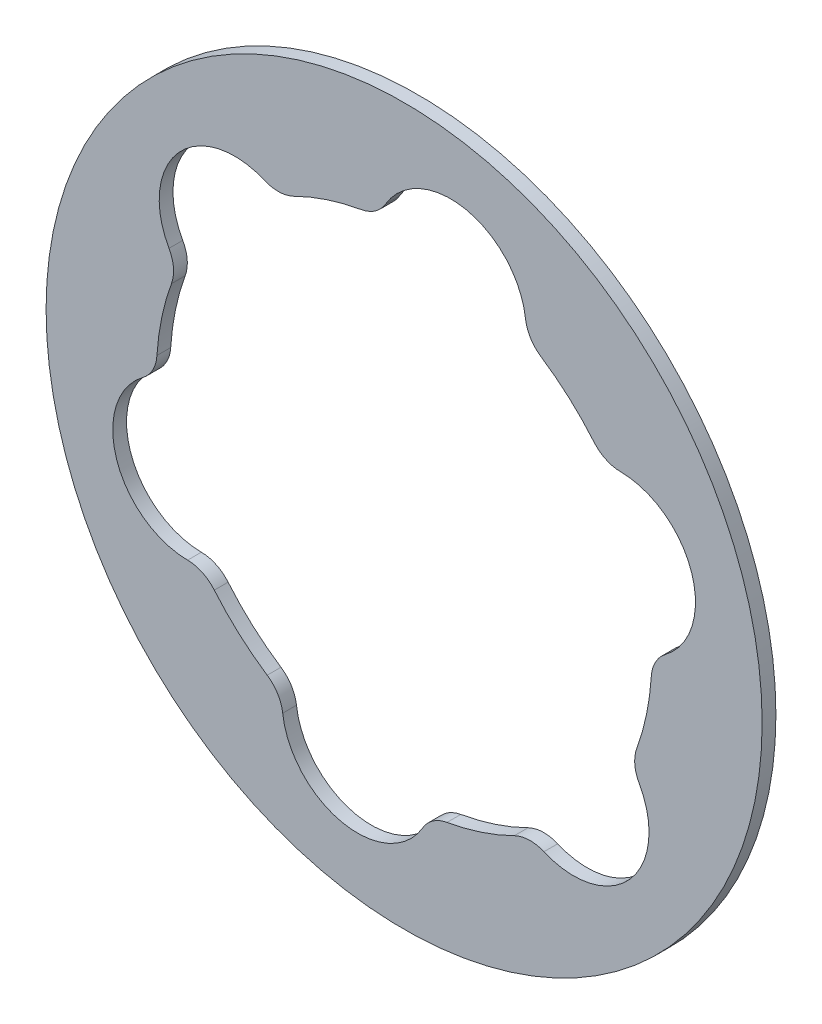
ISO-10303-21;
HEADER;
FILE_DESCRIPTION(('STEP AP214'),'2;1');
FILE_NAME('part.step','',(''),(''),'','','');
FILE_SCHEMA(('AUTOMOTIVE_DESIGN { 1 0 10303 214 1 1 1 1 }'));
ENDSEC;
DATA;
#1=APPLICATION_CONTEXT('core data for automotive mechanical design processes');
#2=APPLICATION_PROTOCOL_DEFINITION('international standard','automotive_design',2000,#1);
#3=PRODUCT_CONTEXT('',#1,'mechanical');
#4=PRODUCT('Part','Part','',(#3));
#5=PRODUCT_RELATED_PRODUCT_CATEGORY('part','',(#4));
#6=PRODUCT_DEFINITION_FORMATION('','',#4);
#7=PRODUCT_DEFINITION_CONTEXT('part definition',#1,'design');
#8=PRODUCT_DEFINITION('design','',#6,#7);
#9=PRODUCT_DEFINITION_SHAPE('','',#8);
#10=(LENGTH_UNIT() NAMED_UNIT(*) SI_UNIT(.MILLI.,.METRE.));
#11=(NAMED_UNIT(*) PLANE_ANGLE_UNIT() SI_UNIT($,.RADIAN.));
#12=(NAMED_UNIT(*) SI_UNIT($,.STERADIAN.) SOLID_ANGLE_UNIT());
#13=UNCERTAINTY_MEASURE_WITH_UNIT(LENGTH_MEASURE(1.E-05),#10,'distance_accuracy_value','');
#14=(GEOMETRIC_REPRESENTATION_CONTEXT(3) GLOBAL_UNCERTAINTY_ASSIGNED_CONTEXT((#13)) GLOBAL_UNIT_ASSIGNED_CONTEXT((#10,
#11,#12)) REPRESENTATION_CONTEXT('',''));
#15=CARTESIAN_POINT('',(0.,0.,0.));
#16=DIRECTION('',(0.,0.,1.));
#17=DIRECTION('',(1.,0.,0.));
#18=AXIS2_PLACEMENT_3D('',#15,#16,#17);
#19=CARTESIAN_POINT('',(0.,0.,0.79375));
#20=DIRECTION('',(0.,0.,1.));
#21=DIRECTION('',(1.,0.,0.));
#22=AXIS2_PLACEMENT_3D('',#19,#20,#21);
#23=PLANE('',#22);
#24=CARTESIAN_POINT('',(596.855492872776,216.819657331889,0.79375));
#25=DIRECTION('',(0.,0.,1.));
#26=DIRECTION('',(1.,0.,0.));
#27=AXIS2_PLACEMENT_3D('',#24,#25,#26);
#28=CIRCLE('',#27,20.6375);
#29=CARTESIAN_POINT('',(617.492992872776,216.819657331889,0.79375));
#30=VERTEX_POINT('',#29);
#31=EDGE_CURVE('E246',#30,#30,#28,.T.);
#32=ORIENTED_EDGE('',*,*,#31,.T.);
#33=EDGE_LOOP('',(#32));
#34=FACE_BOUND('',#33,.T.);
#35=CARTESIAN_POINT('',(609.296784940073,220.911403470376,0.79375));
#36=DIRECTION('',(0.,0.,1.));
#37=DIRECTION('',(1.,0.,0.));
#38=AXIS2_PLACEMENT_3D('',#35,#36,#37);
#39=CIRCLE('',#38,4.35292500000051);
#40=CARTESIAN_POINT('',(611.910584746842,217.43059801391,0.79375));
#41=VERTEX_POINT('',#40);
#42=CARTESIAN_POINT('',(609.334246487327,225.264167269172,0.79375));
#43=VERTEX_POINT('',#42);
#44=EDGE_CURVE('E347',#41,#43,#39,.T.);
#45=ORIENTED_EDGE('',*,*,#44,.F.);
#46=CARTESIAN_POINT('',(613.130739288295,215.805714358083,0.79375));
#47=DIRECTION('',(0.,0.,1.));
#48=DIRECTION('',(1.,0.,0.));
#49=AXIS2_PLACEMENT_3D('',#46,#47,#48);
#50=CIRCLE('',#49,2.032);
#51=CARTESIAN_POINT('',(611.102671199134,215.932062392202,0.79375));
#52=VERTEX_POINT('',#51);
#53=EDGE_CURVE('E295',#41,#52,#50,.T.);
#54=ORIENTED_EDGE('',*,*,#53,.T.);
#55=CARTESIAN_POINT('',(596.855492872776,216.819657331889,0.79375));
#56=DIRECTION('',(0.,0.,1.));
#57=DIRECTION('',(1.,0.,0.));
#58=AXIS2_PLACEMENT_3D('',#55,#56,#57);
#59=CIRCLE('',#58,14.2748000000001);
#60=CARTESIAN_POINT('',(610.267315739796,211.931618622583,0.79375));
#61=VERTEX_POINT('',#60);
#62=EDGE_CURVE('E360',#61,#52,#59,.T.);
#63=ORIENTED_EDGE('',*,*,#62,.F.);
#64=CARTESIAN_POINT('',(612.176472019799,211.235812400618,0.79375));
#65=DIRECTION('',(0.,0.,1.));
#66=DIRECTION('',(1.,0.,0.));
#67=AXIS2_PLACEMENT_3D('',#64,#65,#66);
#68=CIRCLE('',#67,2.032);
#69=CARTESIAN_POINT('',(610.408029808248,210.234994662762,0.79375));
#70=VERTEX_POINT('',#69);
#71=EDGE_CURVE('E241',#61,#70,#68,.T.);
#72=ORIENTED_EDGE('',*,*,#71,.T.);
#73=CARTESIAN_POINT('',(606.619695008191,208.091055414951,0.79375));
#74=DIRECTION('',(0.,0.,1.));
#75=DIRECTION('',(1.,0.,0.));
#76=AXIS2_PLACEMENT_3D('',#73,#74,#75);
#77=CIRCLE('',#76,4.35292500000049);
#78=CARTESIAN_POINT('',(604.912128960644,204.087035653649,0.79375));
#79=VERTEX_POINT('',#78);
#80=EDGE_CURVE('E345',#79,#70,#77,.T.);
#81=ORIENTED_EDGE('',*,*,#80,.F.);
#82=CARTESIAN_POINT('',(604.115015707231,202.217908996295,0.79375));
#83=DIRECTION('',(0.,0.,1.));
#84=DIRECTION('',(1.,0.,0.));
#85=AXIS2_PLACEMENT_3D('',#82,#83,#84);
#86=CIRCLE('',#85,2.032);
#87=CARTESIAN_POINT('',(603.210402269915,204.037441499173,0.79375));
#88=VERTEX_POINT('',#87);
#89=EDGE_CURVE('E278',#79,#88,#86,.T.);
#90=ORIENTED_EDGE('',*,*,#89,.T.);
#91=CARTESIAN_POINT('',(599.328238609345,202.76065866334,0.79375));
#92=VERTEX_POINT('',#91);
#93=EDGE_CURVE('E366',#92,#88,#59,.T.);
#94=ORIENTED_EDGE('',*,*,#93,.F.);
#95=CARTESIAN_POINT('',(599.680230885013,200.75937771408,0.79375));
#96=DIRECTION('',(0.,0.,1.));
#97=DIRECTION('',(1.,0.,0.));
#98=AXIS2_PLACEMENT_3D('',#95,#96,#97);
#99=CIRCLE('',#98,2.032);
#100=CARTESIAN_POINT('',(597.929276193698,201.79048472548,0.79375));
#101=VERTEX_POINT('',#100);
#102=EDGE_CURVE('E280',#92,#101,#99,.T.);
#103=ORIENTED_EDGE('',*,*,#102,.T.);
#104=CARTESIAN_POINT('',(594.178402940894,203.999309276464,0.79375));
#105=DIRECTION('',(0.,0.,1.));
#106=DIRECTION('',(1.,0.,0.));
#107=AXIS2_PLACEMENT_3D('',#104,#105,#106);
#108=CIRCLE('',#107,4.35292499999991);
#109=CARTESIAN_POINT('',(589.857037086579,203.476094971628,0.79375));
#110=VERTEX_POINT('',#109);
#111=EDGE_CURVE('E362',#110,#101,#108,.T.);
#112=ORIENTED_EDGE('',*,*,#111,.F.);
#113=CARTESIAN_POINT('',(587.839769291713,203.2318519701,0.79375));
#114=DIRECTION('',(0.,0.,1.));
#115=DIRECTION('',(1.,0.,0.));
#116=AXIS2_PLACEMENT_3D('',#113,#114,#115);
#117=CIRCLE('',#116,2.032);
#118=CARTESIAN_POINT('',(588.963223943559,204.925036438859,0.79375));
#119=VERTEX_POINT('',#118);
#120=EDGE_CURVE('E282',#110,#119,#117,.T.);
#121=ORIENTED_EDGE('',*,*,#120,.T.);
#122=CARTESIAN_POINT('',(585.916415742325,207.648697372646,0.79375));
#123=VERTEX_POINT('',#122);
#124=EDGE_CURVE('E365',#123,#119,#59,.T.);
#125=ORIENTED_EDGE('',*,*,#124,.F.);
#126=CARTESIAN_POINT('',(584.359251737991,206.343222645351,0.79375));
#127=DIRECTION('',(0.,0.,1.));
#128=DIRECTION('',(1.,0.,0.));
#129=AXIS2_PLACEMENT_3D('',#126,#127,#128);
#130=CIRCLE('',#129,2.032);
#131=CARTESIAN_POINT('',(584.376739258225,208.375147394607,0.79375));
#132=VERTEX_POINT('',#131);
#133=EDGE_CURVE('E284',#123,#132,#130,.T.);
#134=ORIENTED_EDGE('',*,*,#133,.T.);
#135=CARTESIAN_POINT('',(584.414200805479,212.727911193402,0.79375));
#136=DIRECTION('',(0.,0.,1.));
#137=DIRECTION('',(1.,0.,0.));
#138=AXIS2_PLACEMENT_3D('',#135,#136,#137);
#139=CIRCLE('',#138,4.35292499999991);
#140=CARTESIAN_POINT('',(581.80040099871,216.208716649867,0.79375));
#141=VERTEX_POINT('',#140);
#142=EDGE_CURVE('E367',#141,#132,#139,.T.);
#143=ORIENTED_EDGE('',*,*,#142,.F.);
#144=CARTESIAN_POINT('',(580.580246457257,217.833600305694,0.79375));
#145=DIRECTION('',(0.,0.,1.));
#146=DIRECTION('',(1.,0.,0.));
#147=AXIS2_PLACEMENT_3D('',#144,#145,#146);
#148=CIRCLE('',#147,2.032);
#149=CARTESIAN_POINT('',(582.608314546418,217.707252271575,0.79375));
#150=VERTEX_POINT('',#149);
#151=EDGE_CURVE('E286',#141,#150,#148,.T.);
#152=ORIENTED_EDGE('',*,*,#151,.T.);
#153=CARTESIAN_POINT('',(583.443670005756,221.707696041195,0.79375));
#154=VERTEX_POINT('',#153);
#155=EDGE_CURVE('E370',#154,#150,#59,.T.);
#156=ORIENTED_EDGE('',*,*,#155,.F.);
#157=CARTESIAN_POINT('',(581.534513725753,222.40350226316,0.79375));
#158=DIRECTION('',(0.,0.,1.));
#159=DIRECTION('',(1.,0.,0.));
#160=AXIS2_PLACEMENT_3D('',#157,#158,#159);
#161=CIRCLE('',#160,2.032);
#162=CARTESIAN_POINT('',(583.302955937303,223.404320001015,0.79375));
#163=VERTEX_POINT('',#162);
#164=EDGE_CURVE('E275',#154,#163,#161,.T.);
#165=ORIENTED_EDGE('',*,*,#164,.T.);
#166=CARTESIAN_POINT('',(587.09129073736,225.548259248826,0.79375));
#167=DIRECTION('',(0.,0.,1.));
#168=DIRECTION('',(1.,0.,0.));
#169=AXIS2_PLACEMENT_3D('',#166,#167,#168);
#170=CIRCLE('',#169,4.3529250000004);
#171=CARTESIAN_POINT('',(588.798856784906,229.552279010128,0.79375));
#172=VERTEX_POINT('',#171);
#173=EDGE_CURVE('E371',#172,#163,#170,.T.);
#174=ORIENTED_EDGE('',*,*,#173,.F.);
#175=CARTESIAN_POINT('',(589.59597003832,231.421405667483,0.79375));
#176=DIRECTION('',(0.,0.,1.));
#177=DIRECTION('',(1.,0.,0.));
#178=AXIS2_PLACEMENT_3D('',#175,#176,#177);
#179=CIRCLE('',#178,2.032);
#180=CARTESIAN_POINT('',(590.500583475635,229.601873164605,0.79375));
#181=VERTEX_POINT('',#180);
#182=EDGE_CURVE('E288',#172,#181,#179,.T.);
#183=ORIENTED_EDGE('',*,*,#182,.T.);
#184=CARTESIAN_POINT('',(594.382747136207,230.878656000439,0.79375));
#185=VERTEX_POINT('',#184);
#186=EDGE_CURVE('E361',#185,#181,#59,.T.);
#187=ORIENTED_EDGE('',*,*,#186,.F.);
#188=CARTESIAN_POINT('',(594.030754860538,232.879936949699,0.79375));
#189=DIRECTION('',(0.,0.,1.));
#190=DIRECTION('',(1.,0.,0.));
#191=AXIS2_PLACEMENT_3D('',#188,#189,#190);
#192=CIRCLE('',#191,2.032);
#193=CARTESIAN_POINT('',(595.781709551855,231.848829938298,0.79375));
#194=VERTEX_POINT('',#193);
#195=EDGE_CURVE('E290',#185,#194,#192,.T.);
#196=ORIENTED_EDGE('',*,*,#195,.T.);
#197=CARTESIAN_POINT('',(599.532582804658,229.640005387314,0.79375));
#198=DIRECTION('',(0.,0.,1.));
#199=DIRECTION('',(1.,0.,0.));
#200=AXIS2_PLACEMENT_3D('',#197,#198,#199);
#201=CIRCLE('',#200,4.35292500000017);
#202=CARTESIAN_POINT('',(603.853948658973,230.16321969215,0.79375));
#203=VERTEX_POINT('',#202);
#204=EDGE_CURVE('E354',#203,#194,#201,.T.);
#205=ORIENTED_EDGE('',*,*,#204,.F.);
#206=CARTESIAN_POINT('',(605.871216453839,230.407462693678,0.79375));
#207=DIRECTION('',(0.,0.,1.));
#208=DIRECTION('',(1.,0.,0.));
#209=AXIS2_PLACEMENT_3D('',#206,#207,#208);
#210=CIRCLE('',#209,2.032);
#211=CARTESIAN_POINT('',(604.747761801994,228.71427822492,0.79375));
#212=VERTEX_POINT('',#211);
#213=EDGE_CURVE('E68',#203,#212,#210,.T.);
#214=ORIENTED_EDGE('',*,*,#213,.T.);
#215=CARTESIAN_POINT('',(607.794570003227,225.990617291132,0.79375));
#216=VERTEX_POINT('',#215);
#217=EDGE_CURVE('E357',#216,#212,#59,.T.);
#218=ORIENTED_EDGE('',*,*,#217,.F.);
#219=CARTESIAN_POINT('',(609.351734007562,227.296092018427,0.79375));
#220=DIRECTION('',(0.,0.,1.));
#221=DIRECTION('',(1.,0.,0.));
#222=AXIS2_PLACEMENT_3D('',#219,#220,#221);
#223=CIRCLE('',#222,2.032);
#224=EDGE_CURVE('E293',#216,#43,#223,.T.);
#225=ORIENTED_EDGE('',*,*,#224,.T.);
#226=EDGE_LOOP('',(#45,#54,#63,#72,#81,#90,#94,#103,#112,#121,#125,#134,#143,#152,#156,#165,
#174,#183,#187,#196,#205,#214,#218,#225));
#227=FACE_BOUND('',#226,.T.);
#228=ADVANCED_FACE('F53',(#34,#227),#23,.T.);
#229=CARTESIAN_POINT('',(0.,0.,0.));
#230=DIRECTION('',(0.,0.,1.));
#231=DIRECTION('',(1.,0.,0.));
#232=AXIS2_PLACEMENT_3D('',#229,#230,#231);
#233=PLANE('',#232);
#234=CARTESIAN_POINT('',(596.855492872776,216.819657331889,0.));
#235=DIRECTION('',(0.,0.,1.));
#236=DIRECTION('',(1.,0.,0.));
#237=AXIS2_PLACEMENT_3D('',#234,#235,#236);
#238=CIRCLE('',#237,20.6375);
#239=CARTESIAN_POINT('',(617.492992872776,216.819657331889,0.));
#240=VERTEX_POINT('',#239);
#241=EDGE_CURVE('E358',#240,#240,#238,.T.);
#242=ORIENTED_EDGE('',*,*,#241,.F.);
#243=EDGE_LOOP('',(#242));
#244=FACE_BOUND('',#243,.T.);
#245=CARTESIAN_POINT('',(596.855492872776,216.819657331889,0.));
#246=DIRECTION('',(0.,0.,1.));
#247=DIRECTION('',(1.,0.,0.));
#248=AXIS2_PLACEMENT_3D('',#245,#246,#247);
#249=CIRCLE('',#248,14.2748000000001);
#250=CARTESIAN_POINT('',(610.267315739796,211.931618622583,0.));
#251=VERTEX_POINT('',#250);
#252=CARTESIAN_POINT('',(611.102671199134,215.932062392202,0.));
#253=VERTEX_POINT('',#252);
#254=EDGE_CURVE('E218',#251,#253,#249,.T.);
#255=ORIENTED_EDGE('',*,*,#254,.T.);
#256=CARTESIAN_POINT('',(613.130739288295,215.805714358083,0.));
#257=DIRECTION('',(0.,0.,1.));
#258=DIRECTION('',(1.,0.,0.));
#259=AXIS2_PLACEMENT_3D('',#256,#257,#258);
#260=CIRCLE('',#259,2.032);
#261=CARTESIAN_POINT('',(611.910584746842,217.43059801391,0.));
#262=VERTEX_POINT('',#261);
#263=EDGE_CURVE('E268',#253,#262,#260,.F.);
#264=ORIENTED_EDGE('',*,*,#263,.T.);
#265=CARTESIAN_POINT('',(609.296784940073,220.911403470376,0.));
#266=DIRECTION('',(0.,0.,1.));
#267=DIRECTION('',(1.,0.,0.));
#268=AXIS2_PLACEMENT_3D('',#265,#266,#267);
#269=CIRCLE('',#268,4.35292500000051);
#270=CARTESIAN_POINT('',(609.334246487327,225.264167269172,0.));
#271=VERTEX_POINT('',#270);
#272=EDGE_CURVE('E242',#271,#262,#269,.F.);
#273=ORIENTED_EDGE('',*,*,#272,.F.);
#274=CARTESIAN_POINT('',(609.351734007562,227.296092018427,0.));
#275=DIRECTION('',(0.,0.,1.));
#276=DIRECTION('',(1.,0.,0.));
#277=AXIS2_PLACEMENT_3D('',#274,#275,#276);
#278=CIRCLE('',#277,2.032);
#279=CARTESIAN_POINT('',(607.794570003227,225.990617291132,0.));
#280=VERTEX_POINT('',#279);
#281=EDGE_CURVE('E266',#271,#280,#278,.F.);
#282=ORIENTED_EDGE('',*,*,#281,.T.);
#283=CARTESIAN_POINT('',(604.747761801994,228.71427822492,0.));
#284=VERTEX_POINT('',#283);
#285=EDGE_CURVE('E237',#280,#284,#249,.T.);
#286=ORIENTED_EDGE('',*,*,#285,.T.);
#287=CARTESIAN_POINT('',(605.871216453839,230.407462693678,0.));
#288=DIRECTION('',(0.,0.,1.));
#289=DIRECTION('',(1.,0.,0.));
#290=AXIS2_PLACEMENT_3D('',#287,#288,#289);
#291=CIRCLE('',#290,2.032);
#292=CARTESIAN_POINT('',(603.853948658973,230.16321969215,0.));
#293=VERTEX_POINT('',#292);
#294=EDGE_CURVE('E264',#284,#293,#291,.F.);
#295=ORIENTED_EDGE('',*,*,#294,.T.);
#296=CARTESIAN_POINT('',(599.532582804658,229.640005387314,0.));
#297=DIRECTION('',(0.,0.,1.));
#298=DIRECTION('',(1.,0.,0.));
#299=AXIS2_PLACEMENT_3D('',#296,#297,#298);
#300=CIRCLE('',#299,4.35292500000017);
#301=CARTESIAN_POINT('',(595.781709551855,231.848829938298,0.));
#302=VERTEX_POINT('',#301);
#303=EDGE_CURVE('E350',#293,#302,#300,.T.);
#304=ORIENTED_EDGE('',*,*,#303,.T.);
#305=CARTESIAN_POINT('',(594.030754860538,232.879936949699,0.));
#306=DIRECTION('',(0.,0.,1.));
#307=DIRECTION('',(1.,0.,0.));
#308=AXIS2_PLACEMENT_3D('',#305,#306,#307);
#309=CIRCLE('',#308,2.032);
#310=CARTESIAN_POINT('',(594.382747136207,230.878656000439,0.));
#311=VERTEX_POINT('',#310);
#312=EDGE_CURVE('E262',#302,#311,#309,.F.);
#313=ORIENTED_EDGE('',*,*,#312,.T.);
#314=CARTESIAN_POINT('',(590.500583475635,229.601873164605,0.));
#315=VERTEX_POINT('',#314);
#316=EDGE_CURVE('E389',#311,#315,#249,.T.);
#317=ORIENTED_EDGE('',*,*,#316,.T.);
#318=CARTESIAN_POINT('',(589.59597003832,231.421405667483,0.));
#319=DIRECTION('',(0.,0.,1.));
#320=DIRECTION('',(1.,0.,0.));
#321=AXIS2_PLACEMENT_3D('',#318,#319,#320);
#322=CIRCLE('',#321,2.032);
#323=CARTESIAN_POINT('',(588.798856784906,229.552279010128,0.));
#324=VERTEX_POINT('',#323);
#325=EDGE_CURVE('E260',#315,#324,#322,.F.);
#326=ORIENTED_EDGE('',*,*,#325,.T.);
#327=CARTESIAN_POINT('',(587.09129073736,225.548259248826,0.));
#328=DIRECTION('',(0.,0.,1.));
#329=DIRECTION('',(1.,0.,0.));
#330=AXIS2_PLACEMENT_3D('',#327,#328,#329);
#331=CIRCLE('',#330,4.3529250000004);
#332=CARTESIAN_POINT('',(583.302955937303,223.404320001015,0.));
#333=VERTEX_POINT('',#332);
#334=EDGE_CURVE('E387',#324,#333,#331,.T.);
#335=ORIENTED_EDGE('',*,*,#334,.T.);
#336=CARTESIAN_POINT('',(581.534513725753,222.40350226316,0.));
#337=DIRECTION('',(0.,0.,1.));
#338=DIRECTION('',(1.,0.,0.));
#339=AXIS2_PLACEMENT_3D('',#336,#337,#338);
#340=CIRCLE('',#339,2.032);
#341=CARTESIAN_POINT('',(583.443670005756,221.707696041195,0.));
#342=VERTEX_POINT('',#341);
#343=EDGE_CURVE('E226',#333,#342,#340,.F.);
#344=ORIENTED_EDGE('',*,*,#343,.T.);
#345=CARTESIAN_POINT('',(582.608314546418,217.707252271575,0.));
#346=VERTEX_POINT('',#345);
#347=EDGE_CURVE('E386',#342,#346,#249,.T.);
#348=ORIENTED_EDGE('',*,*,#347,.T.);
#349=CARTESIAN_POINT('',(580.580246457257,217.833600305694,0.));
#350=DIRECTION('',(0.,0.,1.));
#351=DIRECTION('',(1.,0.,0.));
#352=AXIS2_PLACEMENT_3D('',#349,#350,#351);
#353=CIRCLE('',#352,2.032);
#354=CARTESIAN_POINT('',(581.80040099871,216.208716649867,0.));
#355=VERTEX_POINT('',#354);
#356=EDGE_CURVE('E258',#346,#355,#353,.F.);
#357=ORIENTED_EDGE('',*,*,#356,.T.);
#358=CARTESIAN_POINT('',(584.414200805479,212.727911193402,0.));
#359=DIRECTION('',(0.,0.,1.));
#360=DIRECTION('',(1.,0.,0.));
#361=AXIS2_PLACEMENT_3D('',#358,#359,#360);
#362=CIRCLE('',#361,4.35292499999991);
#363=CARTESIAN_POINT('',(584.376739258225,208.375147394607,0.));
#364=VERTEX_POINT('',#363);
#365=EDGE_CURVE('E383',#355,#364,#362,.T.);
#366=ORIENTED_EDGE('',*,*,#365,.T.);
#367=CARTESIAN_POINT('',(584.359251737991,206.343222645351,0.));
#368=DIRECTION('',(0.,0.,1.));
#369=DIRECTION('',(1.,0.,0.));
#370=AXIS2_PLACEMENT_3D('',#367,#368,#369);
#371=CIRCLE('',#370,2.032);
#372=CARTESIAN_POINT('',(585.916415742325,207.648697372646,0.));
#373=VERTEX_POINT('',#372);
#374=EDGE_CURVE('E256',#364,#373,#371,.F.);
#375=ORIENTED_EDGE('',*,*,#374,.T.);
#376=CARTESIAN_POINT('',(588.963223943559,204.925036438859,0.));
#377=VERTEX_POINT('',#376);
#378=EDGE_CURVE('E380',#373,#377,#249,.T.);
#379=ORIENTED_EDGE('',*,*,#378,.T.);
#380=CARTESIAN_POINT('',(587.839769291713,203.2318519701,0.));
#381=DIRECTION('',(0.,0.,1.));
#382=DIRECTION('',(1.,0.,0.));
#383=AXIS2_PLACEMENT_3D('',#380,#381,#382);
#384=CIRCLE('',#383,2.032);
#385=CARTESIAN_POINT('',(589.857037086579,203.476094971628,0.));
#386=VERTEX_POINT('',#385);
#387=EDGE_CURVE('E254',#377,#386,#384,.F.);
#388=ORIENTED_EDGE('',*,*,#387,.T.);
#389=CARTESIAN_POINT('',(594.178402940894,203.999309276464,0.));
#390=DIRECTION('',(0.,0.,1.));
#391=DIRECTION('',(1.,0.,0.));
#392=AXIS2_PLACEMENT_3D('',#389,#390,#391);
#393=CIRCLE('',#392,4.35292499999991);
#394=CARTESIAN_POINT('',(597.929276193698,201.79048472548,0.));
#395=VERTEX_POINT('',#394);
#396=EDGE_CURVE('E379',#386,#395,#393,.T.);
#397=ORIENTED_EDGE('',*,*,#396,.T.);
#398=CARTESIAN_POINT('',(599.680230885013,200.75937771408,0.));
#399=DIRECTION('',(0.,0.,1.));
#400=DIRECTION('',(1.,0.,0.));
#401=AXIS2_PLACEMENT_3D('',#398,#399,#400);
#402=CIRCLE('',#401,2.032);
#403=CARTESIAN_POINT('',(599.328238609345,202.76065866334,0.));
#404=VERTEX_POINT('',#403);
#405=EDGE_CURVE('E252',#395,#404,#402,.F.);
#406=ORIENTED_EDGE('',*,*,#405,.T.);
#407=CARTESIAN_POINT('',(603.210402269915,204.037441499173,0.));
#408=VERTEX_POINT('',#407);
#409=EDGE_CURVE('E236',#404,#408,#249,.T.);
#410=ORIENTED_EDGE('',*,*,#409,.T.);
#411=CARTESIAN_POINT('',(604.115015707231,202.217908996295,0.));
#412=DIRECTION('',(0.,0.,1.));
#413=DIRECTION('',(1.,0.,0.));
#414=AXIS2_PLACEMENT_3D('',#411,#412,#413);
#415=CIRCLE('',#414,2.032);
#416=CARTESIAN_POINT('',(604.912128960644,204.087035653649,0.));
#417=VERTEX_POINT('',#416);
#418=EDGE_CURVE('E225',#408,#417,#415,.F.);
#419=ORIENTED_EDGE('',*,*,#418,.T.);
#420=CARTESIAN_POINT('',(606.619695008191,208.091055414951,0.));
#421=DIRECTION('',(0.,0.,1.));
#422=DIRECTION('',(1.,0.,0.));
#423=AXIS2_PLACEMENT_3D('',#420,#421,#422);
#424=CIRCLE('',#423,4.35292500000049);
#425=CARTESIAN_POINT('',(610.408029808248,210.234994662762,0.));
#426=VERTEX_POINT('',#425);
#427=EDGE_CURVE('E220',#417,#426,#424,.T.);
#428=ORIENTED_EDGE('',*,*,#427,.T.);
#429=CARTESIAN_POINT('',(612.176472019799,211.235812400618,0.));
#430=DIRECTION('',(0.,0.,1.));
#431=DIRECTION('',(1.,0.,0.));
#432=AXIS2_PLACEMENT_3D('',#429,#430,#431);
#433=CIRCLE('',#432,2.032);
#434=EDGE_CURVE('E215',#426,#251,#433,.F.);
#435=ORIENTED_EDGE('',*,*,#434,.T.);
#436=EDGE_LOOP('',(#255,#264,#273,#282,#286,#295,#304,#313,#317,#326,#335,#344,#348,#357,#366,
#375,#379,#388,#397,#406,#410,#419,#428,#435));
#437=FACE_BOUND('',#436,.T.);
#438=ADVANCED_FACE('F217',(#244,#437),#233,.F.);
#439=CARTESIAN_POINT('',(599.532582804658,229.640005387314,0.79375));
#440=DIRECTION('',(0.,0.,-1.));
#441=DIRECTION('',(-1.,0.,0.));
#442=AXIS2_PLACEMENT_3D('',#439,#440,#441);
#443=CYLINDRICAL_SURFACE('',#442,4.35292500000017);
#444=ORIENTED_EDGE('',*,*,#303,.F.);
#445=DIRECTION('',(0.,0.,-1.));
#446=VECTOR('',#445,1.);
#447=CARTESIAN_POINT('',(603.853948658973,230.16321969215,0.79375));
#448=LINE('',#447,#446);
#449=EDGE_CURVE('E304',#293,#203,#448,.F.);
#450=ORIENTED_EDGE('',*,*,#449,.T.);
#451=ORIENTED_EDGE('',*,*,#204,.T.);
#452=DIRECTION('',(0.,0.,-1.));
#453=VECTOR('',#452,1.);
#454=CARTESIAN_POINT('',(595.781709551855,231.848829938298,0.79375));
#455=LINE('',#454,#453);
#456=EDGE_CURVE('E301',#194,#302,#455,.T.);
#457=ORIENTED_EDGE('',*,*,#456,.T.);
#458=EDGE_LOOP('',(#444,#450,#451,#457));
#459=FACE_BOUND('',#458,.T.);
#460=ADVANCED_FACE('F456',(#459),#443,.F.);
#461=CARTESIAN_POINT('',(596.855492872776,216.819657331889,0.79375));
#462=DIRECTION('',(0.,0.,-1.));
#463=DIRECTION('',(-1.,0.,0.));
#464=AXIS2_PLACEMENT_3D('',#461,#462,#463);
#465=CYLINDRICAL_SURFACE('',#464,14.2748000000001);
#466=ORIENTED_EDGE('',*,*,#285,.F.);
#467=DIRECTION('',(0.,0.,-1.));
#468=VECTOR('',#467,1.);
#469=CARTESIAN_POINT('',(607.794570003227,225.990617291132,0.79375));
#470=LINE('',#469,#468);
#471=EDGE_CURVE('E75',#280,#216,#470,.F.);
#472=ORIENTED_EDGE('',*,*,#471,.T.);
#473=ORIENTED_EDGE('',*,*,#217,.T.);
#474=DIRECTION('',(0.,0.,-1.));
#475=VECTOR('',#474,1.);
#476=CARTESIAN_POINT('',(604.747761801994,228.71427822492,0.79375));
#477=LINE('',#476,#475);
#478=EDGE_CURVE('E297',#212,#284,#477,.T.);
#479=ORIENTED_EDGE('',*,*,#478,.T.);
#480=EDGE_LOOP('',(#466,#472,#473,#479));
#481=FACE_BOUND('',#480,.T.);
#482=ADVANCED_FACE('F468',(#481),#465,.F.);
#483=ORIENTED_EDGE('',*,*,#62,.T.);
#484=DIRECTION('',(0.,0.,-1.));
#485=VECTOR('',#484,1.);
#486=CARTESIAN_POINT('',(611.102671199134,215.932062392202,0.79375));
#487=LINE('',#486,#485);
#488=EDGE_CURVE('E235',#52,#253,#487,.T.);
#489=ORIENTED_EDGE('',*,*,#488,.T.);
#490=ORIENTED_EDGE('',*,*,#254,.F.);
#491=DIRECTION('',(0.,0.,-1.));
#492=VECTOR('',#491,1.);
#493=CARTESIAN_POINT('',(610.267315739796,211.931618622583,0.79375));
#494=LINE('',#493,#492);
#495=EDGE_CURVE('E232',#251,#61,#494,.F.);
#496=ORIENTED_EDGE('',*,*,#495,.T.);
#497=EDGE_LOOP('',(#483,#489,#490,#496));
#498=FACE_BOUND('',#497,.T.);
#499=ADVANCED_FACE('F231',(#498),#465,.F.);
#500=ORIENTED_EDGE('',*,*,#409,.F.);
#501=DIRECTION('',(0.,0.,-1.));
#502=VECTOR('',#501,1.);
#503=CARTESIAN_POINT('',(599.328238609345,202.76065866334,0.79375));
#504=LINE('',#503,#502);
#505=EDGE_CURVE('E339',#404,#92,#504,.F.);
#506=ORIENTED_EDGE('',*,*,#505,.T.);
#507=ORIENTED_EDGE('',*,*,#93,.T.);
#508=DIRECTION('',(0.,0.,-1.));
#509=VECTOR('',#508,1.);
#510=CARTESIAN_POINT('',(603.210402269915,204.037441499173,0.79375));
#511=LINE('',#510,#509);
#512=EDGE_CURVE('E336',#88,#408,#511,.T.);
#513=ORIENTED_EDGE('',*,*,#512,.T.);
#514=EDGE_LOOP('',(#500,#506,#507,#513));
#515=FACE_BOUND('',#514,.T.);
#516=ADVANCED_FACE('F476',(#515),#465,.F.);
#517=CARTESIAN_POINT('',(594.178402940894,203.999309276464,0.79375));
#518=DIRECTION('',(0.,0.,-1.));
#519=DIRECTION('',(-1.,0.,0.));
#520=AXIS2_PLACEMENT_3D('',#517,#518,#519);
#521=CYLINDRICAL_SURFACE('',#520,4.35292499999991);
#522=ORIENTED_EDGE('',*,*,#396,.F.);
#523=DIRECTION('',(0.,0.,-1.));
#524=VECTOR('',#523,1.);
#525=CARTESIAN_POINT('',(589.857037086579,203.476094971628,0.79375));
#526=LINE('',#525,#524);
#527=EDGE_CURVE('E334',#386,#110,#526,.F.);
#528=ORIENTED_EDGE('',*,*,#527,.T.);
#529=ORIENTED_EDGE('',*,*,#111,.T.);
#530=DIRECTION('',(0.,0.,-1.));
#531=VECTOR('',#530,1.);
#532=CARTESIAN_POINT('',(597.929276193698,201.79048472548,0.79375));
#533=LINE('',#532,#531);
#534=EDGE_CURVE('E331',#101,#395,#533,.T.);
#535=ORIENTED_EDGE('',*,*,#534,.T.);
#536=EDGE_LOOP('',(#522,#528,#529,#535));
#537=FACE_BOUND('',#536,.T.);
#538=ADVANCED_FACE('F473',(#537),#521,.F.);
#539=ORIENTED_EDGE('',*,*,#378,.F.);
#540=DIRECTION('',(0.,0.,-1.));
#541=VECTOR('',#540,1.);
#542=CARTESIAN_POINT('',(585.916415742325,207.648697372646,0.79375));
#543=LINE('',#542,#541);
#544=EDGE_CURVE('E329',#373,#123,#543,.F.);
#545=ORIENTED_EDGE('',*,*,#544,.T.);
#546=ORIENTED_EDGE('',*,*,#124,.T.);
#547=DIRECTION('',(0.,0.,-1.));
#548=VECTOR('',#547,1.);
#549=CARTESIAN_POINT('',(588.963223943559,204.925036438859,0.79375));
#550=LINE('',#549,#548);
#551=EDGE_CURVE('E326',#119,#377,#550,.T.);
#552=ORIENTED_EDGE('',*,*,#551,.T.);
#553=EDGE_LOOP('',(#539,#545,#546,#552));
#554=FACE_BOUND('',#553,.T.);
#555=ADVANCED_FACE('F403',(#554),#465,.F.);
#556=CARTESIAN_POINT('',(584.414200805479,212.727911193402,0.79375));
#557=DIRECTION('',(0.,0.,-1.));
#558=DIRECTION('',(-1.,0.,0.));
#559=AXIS2_PLACEMENT_3D('',#556,#557,#558);
#560=CYLINDRICAL_SURFACE('',#559,4.35292499999991);
#561=ORIENTED_EDGE('',*,*,#365,.F.);
#562=DIRECTION('',(0.,0.,-1.));
#563=VECTOR('',#562,1.);
#564=CARTESIAN_POINT('',(581.80040099871,216.208716649867,0.79375));
#565=LINE('',#564,#563);
#566=EDGE_CURVE('E324',#355,#141,#565,.F.);
#567=ORIENTED_EDGE('',*,*,#566,.T.);
#568=ORIENTED_EDGE('',*,*,#142,.T.);
#569=DIRECTION('',(0.,0.,-1.));
#570=VECTOR('',#569,1.);
#571=CARTESIAN_POINT('',(584.376739258225,208.375147394607,0.79375));
#572=LINE('',#571,#570);
#573=EDGE_CURVE('E321',#132,#364,#572,.T.);
#574=ORIENTED_EDGE('',*,*,#573,.T.);
#575=EDGE_LOOP('',(#561,#567,#568,#574));
#576=FACE_BOUND('',#575,.T.);
#577=ADVANCED_FACE('F416',(#576),#560,.F.);
#578=ORIENTED_EDGE('',*,*,#155,.T.);
#579=DIRECTION('',(0.,0.,-1.));
#580=VECTOR('',#579,1.);
#581=CARTESIAN_POINT('',(582.608314546418,217.707252271575,0.79375));
#582=LINE('',#581,#580);
#583=EDGE_CURVE('E318',#150,#346,#582,.T.);
#584=ORIENTED_EDGE('',*,*,#583,.T.);
#585=ORIENTED_EDGE('',*,*,#347,.F.);
#586=DIRECTION('',(0.,0.,-1.));
#587=VECTOR('',#586,1.);
#588=CARTESIAN_POINT('',(583.443670005756,221.707696041195,0.79375));
#589=LINE('',#588,#587);
#590=EDGE_CURVE('E316',#342,#154,#589,.F.);
#591=ORIENTED_EDGE('',*,*,#590,.T.);
#592=EDGE_LOOP('',(#578,#584,#585,#591));
#593=FACE_BOUND('',#592,.T.);
#594=ADVANCED_FACE('F425',(#593),#465,.F.);
#595=CARTESIAN_POINT('',(587.09129073736,225.548259248826,0.79375));
#596=DIRECTION('',(0.,0.,-1.));
#597=DIRECTION('',(-1.,0.,0.));
#598=AXIS2_PLACEMENT_3D('',#595,#596,#597);
#599=CYLINDRICAL_SURFACE('',#598,4.3529250000004);
#600=ORIENTED_EDGE('',*,*,#334,.F.);
#601=DIRECTION('',(0.,0.,-1.));
#602=VECTOR('',#601,1.);
#603=CARTESIAN_POINT('',(588.798856784906,229.552279010128,0.79375));
#604=LINE('',#603,#602);
#605=EDGE_CURVE('E314',#324,#172,#604,.F.);
#606=ORIENTED_EDGE('',*,*,#605,.T.);
#607=ORIENTED_EDGE('',*,*,#173,.T.);
#608=DIRECTION('',(0.,0.,-1.));
#609=VECTOR('',#608,1.);
#610=CARTESIAN_POINT('',(583.302955937303,223.404320001015,0.79375));
#611=LINE('',#610,#609);
#612=EDGE_CURVE('E311',#163,#333,#611,.T.);
#613=ORIENTED_EDGE('',*,*,#612,.T.);
#614=EDGE_LOOP('',(#600,#606,#607,#613));
#615=FACE_BOUND('',#614,.T.);
#616=ADVANCED_FACE('F440',(#615),#599,.F.);
#617=ORIENTED_EDGE('',*,*,#316,.F.);
#618=DIRECTION('',(0.,0.,-1.));
#619=VECTOR('',#618,1.);
#620=CARTESIAN_POINT('',(594.382747136207,230.878656000439,0.79375));
#621=LINE('',#620,#619);
#622=EDGE_CURVE('E309',#311,#185,#621,.F.);
#623=ORIENTED_EDGE('',*,*,#622,.T.);
#624=ORIENTED_EDGE('',*,*,#186,.T.);
#625=DIRECTION('',(0.,0.,-1.));
#626=VECTOR('',#625,1.);
#627=CARTESIAN_POINT('',(590.500583475635,229.601873164605,0.79375));
#628=LINE('',#627,#626);
#629=EDGE_CURVE('E306',#181,#315,#628,.T.);
#630=ORIENTED_EDGE('',*,*,#629,.T.);
#631=EDGE_LOOP('',(#617,#623,#624,#630));
#632=FACE_BOUND('',#631,.T.);
#633=ADVANCED_FACE('F431',(#632),#465,.F.);
#634=CARTESIAN_POINT('',(596.855492872776,216.819657331889,0.79375));
#635=DIRECTION('',(0.,0.,-1.));
#636=DIRECTION('',(-1.,0.,0.));
#637=AXIS2_PLACEMENT_3D('',#634,#635,#636);
#638=CYLINDRICAL_SURFACE('',#637,20.6375);
#639=ORIENTED_EDGE('',*,*,#31,.F.);
#640=EDGE_LOOP('',(#639));
#641=FACE_BOUND('',#640,.T.);
#642=ORIENTED_EDGE('',*,*,#241,.T.);
#643=EDGE_LOOP('',(#642));
#644=FACE_BOUND('',#643,.T.);
#645=ADVANCED_FACE('F463',(#641,#644),#638,.T.);
#646=CARTESIAN_POINT('',(609.296784940073,220.911403470376,0.79375));
#647=DIRECTION('',(0.,0.,-1.));
#648=DIRECTION('',(-1.,0.,0.));
#649=AXIS2_PLACEMENT_3D('',#646,#647,#648);
#650=CYLINDRICAL_SURFACE('',#649,4.35292500000051);
#651=ORIENTED_EDGE('',*,*,#272,.T.);
#652=DIRECTION('',(0.,0.,-1.));
#653=VECTOR('',#652,1.);
#654=CARTESIAN_POINT('',(611.910584746842,217.43059801391,0.79375));
#655=LINE('',#654,#653);
#656=EDGE_CURVE('E273',#262,#41,#655,.F.);
#657=ORIENTED_EDGE('',*,*,#656,.T.);
#658=ORIENTED_EDGE('',*,*,#44,.T.);
#659=DIRECTION('',(0.,0.,-1.));
#660=VECTOR('',#659,1.);
#661=CARTESIAN_POINT('',(609.334246487327,225.264167269172,0.79375));
#662=LINE('',#661,#660);
#663=EDGE_CURVE('E270',#43,#271,#662,.T.);
#664=ORIENTED_EDGE('',*,*,#663,.T.);
#665=EDGE_LOOP('',(#651,#657,#658,#664));
#666=FACE_BOUND('',#665,.T.);
#667=ADVANCED_FACE('F460',(#666),#650,.F.);
#668=CARTESIAN_POINT('',(606.619695008191,208.091055414951,0.79375));
#669=DIRECTION('',(0.,0.,-1.));
#670=DIRECTION('',(-1.,0.,0.));
#671=AXIS2_PLACEMENT_3D('',#668,#669,#670);
#672=CYLINDRICAL_SURFACE('',#671,4.35292500000049);
#673=ORIENTED_EDGE('',*,*,#427,.F.);
#674=DIRECTION('',(0.,0.,-1.));
#675=VECTOR('',#674,1.);
#676=CARTESIAN_POINT('',(604.912128960644,204.087035653649,0.79375));
#677=LINE('',#676,#675);
#678=EDGE_CURVE('E12',#417,#79,#677,.F.);
#679=ORIENTED_EDGE('',*,*,#678,.T.);
#680=ORIENTED_EDGE('',*,*,#80,.T.);
#681=DIRECTION('',(0.,0.,-1.));
#682=VECTOR('',#681,1.);
#683=CARTESIAN_POINT('',(610.408029808248,210.234994662762,0.79375));
#684=LINE('',#683,#682);
#685=EDGE_CURVE('E61',#70,#426,#684,.T.);
#686=ORIENTED_EDGE('',*,*,#685,.T.);
#687=EDGE_LOOP('',(#673,#679,#680,#686));
#688=FACE_BOUND('',#687,.T.);
#689=ADVANCED_FACE('F342',(#688),#672,.F.);
#690=CARTESIAN_POINT('',(613.130739288295,215.805714358083,0.79375));
#691=DIRECTION('',(0.,0.,-1.));
#692=DIRECTION('',(-1.,0.,0.));
#693=AXIS2_PLACEMENT_3D('',#690,#691,#692);
#694=CYLINDRICAL_SURFACE('',#693,2.032);
#695=ORIENTED_EDGE('',*,*,#53,.F.);
#696=ORIENTED_EDGE('',*,*,#656,.F.);
#697=ORIENTED_EDGE('',*,*,#263,.F.);
#698=ORIENTED_EDGE('',*,*,#488,.F.);
#699=EDGE_LOOP('',(#695,#696,#697,#698));
#700=FACE_BOUND('',#699,.T.);
#701=ADVANCED_FACE('F481',(#700),#694,.T.);
#702=CARTESIAN_POINT('',(609.351734007562,227.296092018427,0.79375));
#703=DIRECTION('',(0.,0.,-1.));
#704=DIRECTION('',(-1.,0.,0.));
#705=AXIS2_PLACEMENT_3D('',#702,#703,#704);
#706=CYLINDRICAL_SURFACE('',#705,2.032);
#707=ORIENTED_EDGE('',*,*,#224,.F.);
#708=ORIENTED_EDGE('',*,*,#471,.F.);
#709=ORIENTED_EDGE('',*,*,#281,.F.);
#710=ORIENTED_EDGE('',*,*,#663,.F.);
#711=EDGE_LOOP('',(#707,#708,#709,#710));
#712=FACE_BOUND('',#711,.T.);
#713=ADVANCED_FACE('F484',(#712),#706,.T.);
#714=CARTESIAN_POINT('',(605.871216453839,230.407462693678,0.79375));
#715=DIRECTION('',(0.,0.,-1.));
#716=DIRECTION('',(-1.,0.,0.));
#717=AXIS2_PLACEMENT_3D('',#714,#715,#716);
#718=CYLINDRICAL_SURFACE('',#717,2.032);
#719=ORIENTED_EDGE('',*,*,#213,.F.);
#720=ORIENTED_EDGE('',*,*,#449,.F.);
#721=ORIENTED_EDGE('',*,*,#294,.F.);
#722=ORIENTED_EDGE('',*,*,#478,.F.);
#723=EDGE_LOOP('',(#719,#720,#721,#722));
#724=FACE_BOUND('',#723,.T.);
#725=ADVANCED_FACE('F488',(#724),#718,.T.);
#726=CARTESIAN_POINT('',(594.030754860538,232.879936949699,0.79375));
#727=DIRECTION('',(0.,0.,-1.));
#728=DIRECTION('',(-1.,0.,0.));
#729=AXIS2_PLACEMENT_3D('',#726,#727,#728);
#730=CYLINDRICAL_SURFACE('',#729,2.032);
#731=ORIENTED_EDGE('',*,*,#195,.F.);
#732=ORIENTED_EDGE('',*,*,#622,.F.);
#733=ORIENTED_EDGE('',*,*,#312,.F.);
#734=ORIENTED_EDGE('',*,*,#456,.F.);
#735=EDGE_LOOP('',(#731,#732,#733,#734));
#736=FACE_BOUND('',#735,.T.);
#737=ADVANCED_FACE('F492',(#736),#730,.T.);
#738=CARTESIAN_POINT('',(589.59597003832,231.421405667483,0.79375));
#739=DIRECTION('',(0.,0.,-1.));
#740=DIRECTION('',(-1.,0.,0.));
#741=AXIS2_PLACEMENT_3D('',#738,#739,#740);
#742=CYLINDRICAL_SURFACE('',#741,2.032);
#743=ORIENTED_EDGE('',*,*,#182,.F.);
#744=ORIENTED_EDGE('',*,*,#605,.F.);
#745=ORIENTED_EDGE('',*,*,#325,.F.);
#746=ORIENTED_EDGE('',*,*,#629,.F.);
#747=EDGE_LOOP('',(#743,#744,#745,#746));
#748=FACE_BOUND('',#747,.T.);
#749=ADVANCED_FACE('F436',(#748),#742,.T.);
#750=CARTESIAN_POINT('',(580.580246457257,217.833600305694,0.79375));
#751=DIRECTION('',(0.,0.,-1.));
#752=DIRECTION('',(-1.,0.,0.));
#753=AXIS2_PLACEMENT_3D('',#750,#751,#752);
#754=CYLINDRICAL_SURFACE('',#753,2.032);
#755=ORIENTED_EDGE('',*,*,#151,.F.);
#756=ORIENTED_EDGE('',*,*,#566,.F.);
#757=ORIENTED_EDGE('',*,*,#356,.F.);
#758=ORIENTED_EDGE('',*,*,#583,.F.);
#759=EDGE_LOOP('',(#755,#756,#757,#758));
#760=FACE_BOUND('',#759,.T.);
#761=ADVANCED_FACE('F419',(#760),#754,.T.);
#762=CARTESIAN_POINT('',(584.359251737991,206.343222645351,0.79375));
#763=DIRECTION('',(0.,0.,-1.));
#764=DIRECTION('',(-1.,0.,0.));
#765=AXIS2_PLACEMENT_3D('',#762,#763,#764);
#766=CYLINDRICAL_SURFACE('',#765,2.032);
#767=ORIENTED_EDGE('',*,*,#133,.F.);
#768=ORIENTED_EDGE('',*,*,#544,.F.);
#769=ORIENTED_EDGE('',*,*,#374,.F.);
#770=ORIENTED_EDGE('',*,*,#573,.F.);
#771=EDGE_LOOP('',(#767,#768,#769,#770));
#772=FACE_BOUND('',#771,.T.);
#773=ADVANCED_FACE('F409',(#772),#766,.T.);
#774=CARTESIAN_POINT('',(587.839769291713,203.2318519701,0.79375));
#775=DIRECTION('',(0.,0.,-1.));
#776=DIRECTION('',(-1.,0.,0.));
#777=AXIS2_PLACEMENT_3D('',#774,#775,#776);
#778=CYLINDRICAL_SURFACE('',#777,2.032);
#779=ORIENTED_EDGE('',*,*,#120,.F.);
#780=ORIENTED_EDGE('',*,*,#527,.F.);
#781=ORIENTED_EDGE('',*,*,#387,.F.);
#782=ORIENTED_EDGE('',*,*,#551,.F.);
#783=EDGE_LOOP('',(#779,#780,#781,#782));
#784=FACE_BOUND('',#783,.T.);
#785=ADVANCED_FACE('F503',(#784),#778,.T.);
#786=CARTESIAN_POINT('',(599.680230885013,200.75937771408,0.79375));
#787=DIRECTION('',(0.,0.,-1.));
#788=DIRECTION('',(-1.,0.,0.));
#789=AXIS2_PLACEMENT_3D('',#786,#787,#788);
#790=CYLINDRICAL_SURFACE('',#789,2.032);
#791=ORIENTED_EDGE('',*,*,#102,.F.);
#792=ORIENTED_EDGE('',*,*,#505,.F.);
#793=ORIENTED_EDGE('',*,*,#405,.F.);
#794=ORIENTED_EDGE('',*,*,#534,.F.);
#795=EDGE_LOOP('',(#791,#792,#793,#794));
#796=FACE_BOUND('',#795,.T.);
#797=ADVANCED_FACE('F506',(#796),#790,.T.);
#798=CARTESIAN_POINT('',(604.115015707231,202.217908996295,0.79375));
#799=DIRECTION('',(0.,0.,-1.));
#800=DIRECTION('',(-1.,0.,0.));
#801=AXIS2_PLACEMENT_3D('',#798,#799,#800);
#802=CYLINDRICAL_SURFACE('',#801,2.032);
#803=ORIENTED_EDGE('',*,*,#89,.F.);
#804=ORIENTED_EDGE('',*,*,#678,.F.);
#805=ORIENTED_EDGE('',*,*,#418,.F.);
#806=ORIENTED_EDGE('',*,*,#512,.F.);
#807=EDGE_LOOP('',(#803,#804,#805,#806));
#808=FACE_BOUND('',#807,.T.);
#809=ADVANCED_FACE('F448',(#808),#802,.T.);
#810=CARTESIAN_POINT('',(612.176472019799,211.235812400618,0.79375));
#811=DIRECTION('',(0.,0.,-1.));
#812=DIRECTION('',(-1.,0.,0.));
#813=AXIS2_PLACEMENT_3D('',#810,#811,#812);
#814=CYLINDRICAL_SURFACE('',#813,2.032);
#815=ORIENTED_EDGE('',*,*,#71,.F.);
#816=ORIENTED_EDGE('',*,*,#495,.F.);
#817=ORIENTED_EDGE('',*,*,#434,.F.);
#818=ORIENTED_EDGE('',*,*,#685,.F.);
#819=EDGE_LOOP('',(#815,#816,#817,#818));
#820=FACE_BOUND('',#819,.T.);
#821=ADVANCED_FACE('F240',(#820),#814,.T.);
#822=CARTESIAN_POINT('',(581.534513725753,222.40350226316,0.79375));
#823=DIRECTION('',(0.,0.,-1.));
#824=DIRECTION('',(-1.,0.,0.));
#825=AXIS2_PLACEMENT_3D('',#822,#823,#824);
#826=CYLINDRICAL_SURFACE('',#825,2.032);
#827=ORIENTED_EDGE('',*,*,#164,.F.);
#828=ORIENTED_EDGE('',*,*,#590,.F.);
#829=ORIENTED_EDGE('',*,*,#343,.F.);
#830=ORIENTED_EDGE('',*,*,#612,.F.);
#831=EDGE_LOOP('',(#827,#828,#829,#830));
#832=FACE_BOUND('',#831,.T.);
#833=ADVANCED_FACE('F55',(#832),#826,.T.);
#834=CLOSED_SHELL('',(#228,#438,#460,#482,#499,#516,#538,#555,#577,#594,#616,#633,#645,#667,
#689,#701,#713,#725,#737,#749,#761,#773,#785,#797,#809,#821,#833));
#835=MANIFOLD_SOLID_BREP('B2',#834);
#836=ADVANCED_BREP_SHAPE_REPRESENTATION('',(#18,#835),#14);
#837=SHAPE_DEFINITION_REPRESENTATION(#9,#836);
ENDSEC;
END-ISO-10303-21;
